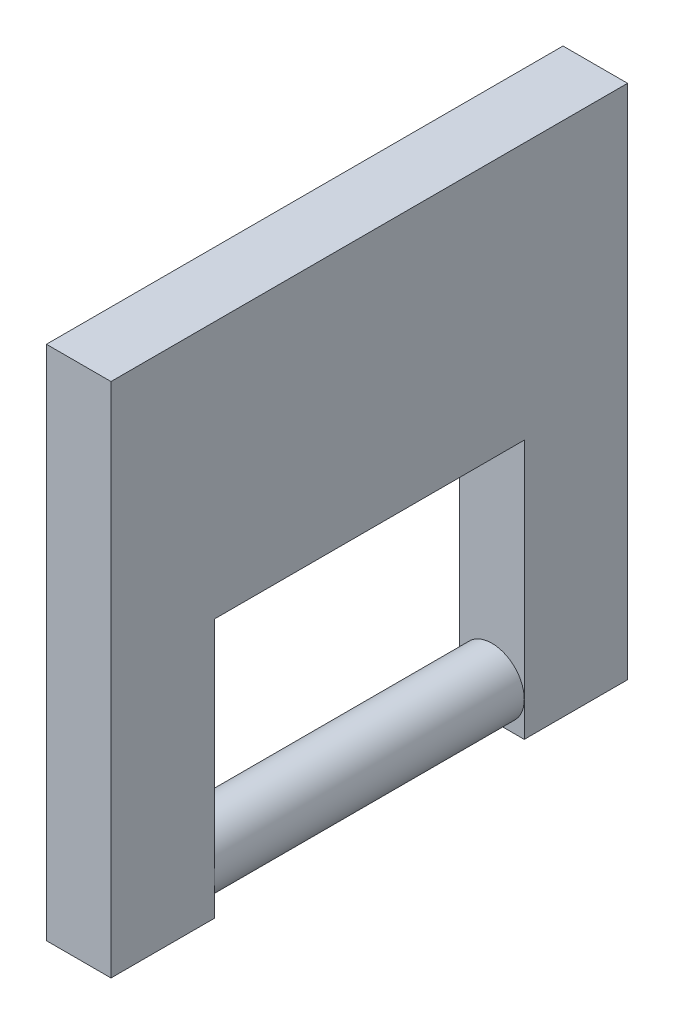
ISO-10303-21;
HEADER;
FILE_DESCRIPTION(('STEP AP214'),'2;1');
FILE_NAME('part.step','',(''),(''),'','','');
FILE_SCHEMA(('AUTOMOTIVE_DESIGN { 1 0 10303 214 1 1 1 1 }'));
ENDSEC;
DATA;
#1=APPLICATION_CONTEXT('core data for automotive mechanical design processes');
#2=APPLICATION_PROTOCOL_DEFINITION('international standard','automotive_design',2000,#1);
#3=PRODUCT_CONTEXT('',#1,'mechanical');
#4=PRODUCT('Part','Part','',(#3));
#5=PRODUCT_RELATED_PRODUCT_CATEGORY('part','',(#4));
#6=PRODUCT_DEFINITION_FORMATION('','',#4);
#7=PRODUCT_DEFINITION_CONTEXT('part definition',#1,'design');
#8=PRODUCT_DEFINITION('design','',#6,#7);
#9=PRODUCT_DEFINITION_SHAPE('','',#8);
#10=(LENGTH_UNIT() NAMED_UNIT(*) SI_UNIT(.MILLI.,.METRE.));
#11=(NAMED_UNIT(*) PLANE_ANGLE_UNIT() SI_UNIT($,.RADIAN.));
#12=(NAMED_UNIT(*) SI_UNIT($,.STERADIAN.) SOLID_ANGLE_UNIT());
#13=UNCERTAINTY_MEASURE_WITH_UNIT(LENGTH_MEASURE(1.E-05),#10,'distance_accuracy_value','');
#14=(GEOMETRIC_REPRESENTATION_CONTEXT(3) GLOBAL_UNCERTAINTY_ASSIGNED_CONTEXT((#13)) GLOBAL_UNIT_ASSIGNED_CONTEXT((#10,
#11,#12)) REPRESENTATION_CONTEXT('',''));
#15=CARTESIAN_POINT('',(0.,0.,0.));
#16=DIRECTION('',(0.,0.,1.));
#17=DIRECTION('',(1.,0.,0.));
#18=AXIS2_PLACEMENT_3D('',#15,#16,#17);
#19=CARTESIAN_POINT('',(0.,-31.7574793875147,45.827703180212));
#20=DIRECTION('',(0.,0.,-1.));
#21=DIRECTION('',(-1.,0.,0.));
#22=AXIS2_PLACEMENT_3D('',#19,#20,#21);
#23=PLANE('',#22);
#24=CARTESIAN_POINT('',(1.5875,-30.0448686602337,45.827703180212));
#25=DIRECTION('',(0.,0.,1.));
#26=DIRECTION('',(1.,0.,0.));
#27=AXIS2_PLACEMENT_3D('',#24,#25,#26);
#28=CIRCLE('',#27,1.5875);
#29=CARTESIAN_POINT('',(0.,-30.0448686602337,45.827703180212));
#30=VERTEX_POINT('',#29);
#31=CARTESIAN_POINT('',(3.175,-30.0448686602337,45.827703180212));
#32=VERTEX_POINT('',#31);
#33=EDGE_CURVE('E140',#30,#32,#28,.T.);
#34=ORIENTED_EDGE('',*,*,#33,.F.);
#35=DIRECTION('',(0.,1.,0.));
#36=VECTOR('',#35,1.);
#37=CARTESIAN_POINT('',(0.,-31.7574793875147,45.827703180212));
#38=LINE('',#37,#36);
#39=CARTESIAN_POINT('',(0.,-31.7574793875147,45.827703180212));
#40=VERTEX_POINT('',#39);
#41=EDGE_CURVE('E143',#40,#30,#38,.T.);
#42=ORIENTED_EDGE('',*,*,#41,.F.);
#43=DIRECTION('',(1.,0.,0.));
#44=VECTOR('',#43,1.);
#45=CARTESIAN_POINT('',(0.,-31.7574793875147,45.827703180212));
#46=LINE('',#45,#44);
#47=CARTESIAN_POINT('',(3.175,-31.7574793875147,45.827703180212));
#48=VERTEX_POINT('',#47);
#49=EDGE_CURVE('E153',#40,#48,#46,.T.);
#50=ORIENTED_EDGE('',*,*,#49,.T.);
#51=DIRECTION('',(0.,1.,0.));
#52=VECTOR('',#51,1.);
#53=CARTESIAN_POINT('',(3.175,-31.7574793875147,45.827703180212));
#54=LINE('',#53,#52);
#55=EDGE_CURVE('E138',#48,#32,#54,.T.);
#56=ORIENTED_EDGE('',*,*,#55,.T.);
#57=EDGE_LOOP('',(#34,#42,#50,#56));
#58=FACE_BOUND('',#57,.T.);
#59=ADVANCED_FACE('F33',(#58),#23,.F.);
#60=EDGE_CURVE('E48',#32,#30,#28,.T.);
#61=ORIENTED_EDGE('',*,*,#60,.F.);
#62=CARTESIAN_POINT('',(3.175,-19.0128997924515,45.827703180212));
#63=VERTEX_POINT('',#62);
#64=EDGE_CURVE('E136',#32,#63,#54,.T.);
#65=ORIENTED_EDGE('',*,*,#64,.T.);
#66=DIRECTION('',(1.,0.,0.));
#67=VECTOR('',#66,1.);
#68=CARTESIAN_POINT('',(0.,-19.0128997924515,45.827703180212));
#69=LINE('',#68,#67);
#70=CARTESIAN_POINT('',(0.,-19.0128997924515,45.827703180212));
#71=VERTEX_POINT('',#70);
#72=EDGE_CURVE('E149',#71,#63,#69,.T.);
#73=ORIENTED_EDGE('',*,*,#72,.F.);
#74=EDGE_CURVE('E117',#30,#71,#38,.T.);
#75=ORIENTED_EDGE('',*,*,#74,.F.);
#76=EDGE_LOOP('',(#61,#65,#73,#75));
#77=FACE_BOUND('',#76,.T.);
#78=ADVANCED_FACE('F217',(#77),#23,.F.);
#79=CARTESIAN_POINT('',(0.,-31.7574793875147,61.067703180212));
#80=DIRECTION('',(0.,0.,1.));
#81=DIRECTION('',(1.,0.,0.));
#82=AXIS2_PLACEMENT_3D('',#79,#80,#81);
#83=PLANE('',#82);
#84=CARTESIAN_POINT('',(1.5875,-30.0448686602337,61.067703180212));
#85=DIRECTION('',(0.,0.,1.));
#86=DIRECTION('',(1.,0.,0.));
#87=AXIS2_PLACEMENT_3D('',#84,#85,#86);
#88=CIRCLE('',#87,1.5875);
#89=CARTESIAN_POINT('',(3.175,-30.0448686602337,61.067703180212));
#90=VERTEX_POINT('',#89);
#91=CARTESIAN_POINT('',(0.,-30.0448686602337,61.067703180212));
#92=VERTEX_POINT('',#91);
#93=EDGE_CURVE('E11',#90,#92,#88,.F.);
#94=ORIENTED_EDGE('',*,*,#93,.F.);
#95=DIRECTION('',(0.,-1.,0.));
#96=VECTOR('',#95,1.);
#97=CARTESIAN_POINT('',(3.175,-31.7574793875147,61.067703180212));
#98=LINE('',#97,#96);
#99=CARTESIAN_POINT('',(3.175,-31.7574793875147,61.067703180212));
#100=VERTEX_POINT('',#99);
#101=EDGE_CURVE('E118',#90,#100,#98,.T.);
#102=ORIENTED_EDGE('',*,*,#101,.T.);
#103=DIRECTION('',(1.,0.,0.));
#104=VECTOR('',#103,1.);
#105=CARTESIAN_POINT('',(0.,-31.7574793875147,61.067703180212));
#106=LINE('',#105,#104);
#107=CARTESIAN_POINT('',(0.,-31.7574793875147,61.067703180212));
#108=VERTEX_POINT('',#107);
#109=EDGE_CURVE('E156',#108,#100,#106,.T.);
#110=ORIENTED_EDGE('',*,*,#109,.F.);
#111=DIRECTION('',(0.,-1.,0.));
#112=VECTOR('',#111,1.);
#113=CARTESIAN_POINT('',(0.,-31.7574793875147,61.067703180212));
#114=LINE('',#113,#112);
#115=EDGE_CURVE('E131',#92,#108,#114,.T.);
#116=ORIENTED_EDGE('',*,*,#115,.F.);
#117=EDGE_LOOP('',(#94,#102,#110,#116));
#118=FACE_BOUND('',#117,.T.);
#119=ADVANCED_FACE('F130',(#118),#83,.F.);
#120=CARTESIAN_POINT('',(1.5875,-30.0448686602337,61.067703180212));
#121=DIRECTION('',(0.,0.,1.));
#122=DIRECTION('',(1.,0.,0.));
#123=AXIS2_PLACEMENT_3D('',#120,#121,#122);
#124=CIRCLE('',#123,1.5875);
#125=EDGE_CURVE('E56',#90,#92,#124,.T.);
#126=ORIENTED_EDGE('',*,*,#125,.T.);
#127=CARTESIAN_POINT('',(0.,-19.0128997924515,61.067703180212));
#128=VERTEX_POINT('',#127);
#129=EDGE_CURVE('E148',#128,#92,#114,.T.);
#130=ORIENTED_EDGE('',*,*,#129,.F.);
#131=DIRECTION('',(1.,0.,0.));
#132=VECTOR('',#131,1.);
#133=CARTESIAN_POINT('',(0.,-19.0128997924515,61.067703180212));
#134=LINE('',#133,#132);
#135=CARTESIAN_POINT('',(3.175,-19.0128997924515,61.067703180212));
#136=VERTEX_POINT('',#135);
#137=EDGE_CURVE('E113',#128,#136,#134,.T.);
#138=ORIENTED_EDGE('',*,*,#137,.T.);
#139=EDGE_CURVE('E109',#136,#90,#98,.T.);
#140=ORIENTED_EDGE('',*,*,#139,.T.);
#141=EDGE_LOOP('',(#126,#130,#138,#140));
#142=FACE_BOUND('',#141,.T.);
#143=ADVANCED_FACE('F111',(#142),#83,.F.);
#144=CARTESIAN_POINT('',(3.175,-31.7574793875147,66.147703180212));
#145=DIRECTION('',(0.,1.,0.));
#146=DIRECTION('',(0.,0.,1.));
#147=AXIS2_PLACEMENT_3D('',#144,#145,#146);
#148=PLANE('',#147);
#149=DIRECTION('',(0.,0.,-1.));
#150=VECTOR('',#149,1.);
#151=CARTESIAN_POINT('',(3.175,-31.7574793875147,66.147703180212));
#152=LINE('',#151,#150);
#153=CARTESIAN_POINT('',(3.175,-31.7574793875147,40.747703180212));
#154=VERTEX_POINT('',#153);
#155=EDGE_CURVE('E163',#48,#154,#152,.T.);
#156=ORIENTED_EDGE('',*,*,#155,.F.);
#157=ORIENTED_EDGE('',*,*,#49,.F.);
#158=DIRECTION('',(0.,0.,-1.));
#159=VECTOR('',#158,1.);
#160=CARTESIAN_POINT('',(0.,-31.7574793875147,66.147703180212));
#161=LINE('',#160,#159);
#162=CARTESIAN_POINT('',(0.,-31.7574793875147,40.747703180212));
#163=VERTEX_POINT('',#162);
#164=EDGE_CURVE('E173',#40,#163,#161,.T.);
#165=ORIENTED_EDGE('',*,*,#164,.T.);
#166=DIRECTION('',(-1.,0.,0.));
#167=VECTOR('',#166,1.);
#168=CARTESIAN_POINT('',(3.175,-31.7574793875147,40.747703180212));
#169=LINE('',#168,#167);
#170=EDGE_CURVE('E185',#154,#163,#169,.T.);
#171=ORIENTED_EDGE('',*,*,#170,.F.);
#172=EDGE_LOOP('',(#156,#157,#165,#171));
#173=FACE_BOUND('',#172,.T.);
#174=ADVANCED_FACE('F235',(#173),#148,.F.);
#175=CARTESIAN_POINT('',(3.175,-6.35747938751472,66.147703180212));
#176=DIRECTION('',(0.,0.,-1.));
#177=DIRECTION('',(-1.,0.,0.));
#178=AXIS2_PLACEMENT_3D('',#175,#176,#177);
#179=PLANE('',#178);
#180=DIRECTION('',(0.,-1.,0.));
#181=VECTOR('',#180,1.);
#182=CARTESIAN_POINT('',(0.,-6.35747938751472,66.147703180212));
#183=LINE('',#182,#181);
#184=CARTESIAN_POINT('',(0.,-6.35747938751472,66.147703180212));
#185=VERTEX_POINT('',#184);
#186=CARTESIAN_POINT('',(0.,-31.7574793875147,66.147703180212));
#187=VERTEX_POINT('',#186);
#188=EDGE_CURVE('E155',#185,#187,#183,.T.);
#189=ORIENTED_EDGE('',*,*,#188,.T.);
#190=DIRECTION('',(-1.,0.,0.));
#191=VECTOR('',#190,1.);
#192=CARTESIAN_POINT('',(3.175,-31.7574793875147,66.147703180212));
#193=LINE('',#192,#191);
#194=CARTESIAN_POINT('',(3.175,-31.7574793875147,66.147703180212));
#195=VERTEX_POINT('',#194);
#196=EDGE_CURVE('E41',#195,#187,#193,.T.);
#197=ORIENTED_EDGE('',*,*,#196,.F.);
#198=DIRECTION('',(0.,-1.,0.));
#199=VECTOR('',#198,1.);
#200=CARTESIAN_POINT('',(3.175,-6.35747938751472,66.147703180212));
#201=LINE('',#200,#199);
#202=CARTESIAN_POINT('',(3.175,-6.35747938751472,66.147703180212));
#203=VERTEX_POINT('',#202);
#204=EDGE_CURVE('E161',#203,#195,#201,.T.);
#205=ORIENTED_EDGE('',*,*,#204,.F.);
#206=DIRECTION('',(-1.,0.,0.));
#207=VECTOR('',#206,1.);
#208=CARTESIAN_POINT('',(3.175,-6.35747938751472,66.147703180212));
#209=LINE('',#208,#207);
#210=EDGE_CURVE('E170',#203,#185,#209,.T.);
#211=ORIENTED_EDGE('',*,*,#210,.T.);
#212=EDGE_LOOP('',(#189,#197,#205,#211));
#213=FACE_BOUND('',#212,.T.);
#214=ADVANCED_FACE('F35',(#213),#179,.F.);
#215=EDGE_CURVE('E174',#187,#108,#161,.T.);
#216=ORIENTED_EDGE('',*,*,#215,.T.);
#217=ORIENTED_EDGE('',*,*,#109,.T.);
#218=EDGE_CURVE('E125',#195,#100,#152,.T.);
#219=ORIENTED_EDGE('',*,*,#218,.F.);
#220=ORIENTED_EDGE('',*,*,#196,.T.);
#221=EDGE_LOOP('',(#216,#217,#219,#220));
#222=FACE_BOUND('',#221,.T.);
#223=ADVANCED_FACE('F190',(#222),#148,.F.);
#224=CARTESIAN_POINT('',(3.175,-6.35747938751472,40.747703180212));
#225=DIRECTION('',(0.,0.,1.));
#226=DIRECTION('',(0.,-1.,0.));
#227=AXIS2_PLACEMENT_3D('',#224,#225,#226);
#228=PLANE('',#227);
#229=DIRECTION('',(0.,1.,0.));
#230=VECTOR('',#229,1.);
#231=CARTESIAN_POINT('',(0.,-6.35747938751472,40.747703180212));
#232=LINE('',#231,#230);
#233=CARTESIAN_POINT('',(0.,-6.35747938751472,40.747703180212));
#234=VERTEX_POINT('',#233);
#235=EDGE_CURVE('E177',#163,#234,#232,.T.);
#236=ORIENTED_EDGE('',*,*,#235,.T.);
#237=DIRECTION('',(-1.,0.,0.));
#238=VECTOR('',#237,1.);
#239=CARTESIAN_POINT('',(3.175,-6.35747938751472,40.747703180212));
#240=LINE('',#239,#238);
#241=CARTESIAN_POINT('',(3.175,-6.35747938751472,40.747703180212));
#242=VERTEX_POINT('',#241);
#243=EDGE_CURVE('E182',#242,#234,#240,.T.);
#244=ORIENTED_EDGE('',*,*,#243,.F.);
#245=DIRECTION('',(0.,1.,0.));
#246=VECTOR('',#245,1.);
#247=CARTESIAN_POINT('',(3.175,-6.35747938751472,40.747703180212));
#248=LINE('',#247,#246);
#249=EDGE_CURVE('E166',#154,#242,#248,.T.);
#250=ORIENTED_EDGE('',*,*,#249,.F.);
#251=ORIENTED_EDGE('',*,*,#170,.T.);
#252=EDGE_LOOP('',(#236,#244,#250,#251));
#253=FACE_BOUND('',#252,.T.);
#254=ADVANCED_FACE('F230',(#253),#228,.F.);
#255=CARTESIAN_POINT('',(3.175,-6.35747938751472,66.147703180212));
#256=DIRECTION('',(0.,-1.,0.));
#257=DIRECTION('',(0.,0.,-1.));
#258=AXIS2_PLACEMENT_3D('',#255,#256,#257);
#259=PLANE('',#258);
#260=DIRECTION('',(0.,0.,1.));
#261=VECTOR('',#260,1.);
#262=CARTESIAN_POINT('',(0.,-6.35747938751472,66.147703180212));
#263=LINE('',#262,#261);
#264=EDGE_CURVE('E164',#234,#185,#263,.T.);
#265=ORIENTED_EDGE('',*,*,#264,.T.);
#266=ORIENTED_EDGE('',*,*,#210,.F.);
#267=DIRECTION('',(0.,0.,1.));
#268=VECTOR('',#267,1.);
#269=CARTESIAN_POINT('',(3.175,-6.35747938751472,66.147703180212));
#270=LINE('',#269,#268);
#271=EDGE_CURVE('E168',#242,#203,#270,.T.);
#272=ORIENTED_EDGE('',*,*,#271,.F.);
#273=ORIENTED_EDGE('',*,*,#243,.T.);
#274=EDGE_LOOP('',(#265,#266,#272,#273));
#275=FACE_BOUND('',#274,.T.);
#276=ADVANCED_FACE('F225',(#275),#259,.F.);
#277=CARTESIAN_POINT('',(3.175,-31.7574793875147,66.147703180212));
#278=DIRECTION('',(1.,0.,0.));
#279=DIRECTION('',(0.,0.,-1.));
#280=AXIS2_PLACEMENT_3D('',#277,#278,#279);
#281=PLANE('',#280);
#282=ORIENTED_EDGE('',*,*,#55,.F.);
#283=ORIENTED_EDGE('',*,*,#155,.T.);
#284=ORIENTED_EDGE('',*,*,#249,.T.);
#285=ORIENTED_EDGE('',*,*,#271,.T.);
#286=ORIENTED_EDGE('',*,*,#204,.T.);
#287=ORIENTED_EDGE('',*,*,#218,.T.);
#288=ORIENTED_EDGE('',*,*,#101,.F.);
#289=ORIENTED_EDGE('',*,*,#139,.F.);
#290=DIRECTION('',(0.,0.,1.));
#291=VECTOR('',#290,1.);
#292=CARTESIAN_POINT('',(3.175,-19.0128997924515,45.827703180212));
#293=LINE('',#292,#291);
#294=EDGE_CURVE('E129',#63,#136,#293,.T.);
#295=ORIENTED_EDGE('',*,*,#294,.F.);
#296=ORIENTED_EDGE('',*,*,#64,.F.);
#297=EDGE_LOOP('',(#282,#283,#284,#285,#286,#287,#288,#289,#295,#296));
#298=FACE_BOUND('',#297,.T.);
#299=ADVANCED_FACE('F123',(#298),#281,.T.);
#300=CARTESIAN_POINT('',(0.,-31.7574793875147,66.147703180212));
#301=DIRECTION('',(1.,0.,0.));
#302=DIRECTION('',(0.,0.,-1.));
#303=AXIS2_PLACEMENT_3D('',#300,#301,#302);
#304=PLANE('',#303);
#305=ORIENTED_EDGE('',*,*,#164,.F.);
#306=ORIENTED_EDGE('',*,*,#41,.T.);
#307=ORIENTED_EDGE('',*,*,#74,.T.);
#308=DIRECTION('',(0.,0.,1.));
#309=VECTOR('',#308,1.);
#310=CARTESIAN_POINT('',(0.,-19.0128997924515,45.827703180212));
#311=LINE('',#310,#309);
#312=EDGE_CURVE('E145',#71,#128,#311,.T.);
#313=ORIENTED_EDGE('',*,*,#312,.T.);
#314=ORIENTED_EDGE('',*,*,#129,.T.);
#315=ORIENTED_EDGE('',*,*,#115,.T.);
#316=ORIENTED_EDGE('',*,*,#215,.F.);
#317=ORIENTED_EDGE('',*,*,#188,.F.);
#318=ORIENTED_EDGE('',*,*,#264,.F.);
#319=ORIENTED_EDGE('',*,*,#235,.F.);
#320=EDGE_LOOP('',(#305,#306,#307,#313,#314,#315,#316,#317,#318,#319));
#321=FACE_BOUND('',#320,.T.);
#322=ADVANCED_FACE('F198',(#321),#304,.F.);
#323=CARTESIAN_POINT('',(0.,-19.0128997924515,45.827703180212));
#324=DIRECTION('',(0.,1.,0.));
#325=DIRECTION('',(0.,0.,1.));
#326=AXIS2_PLACEMENT_3D('',#323,#324,#325);
#327=PLANE('',#326);
#328=ORIENTED_EDGE('',*,*,#294,.T.);
#329=ORIENTED_EDGE('',*,*,#137,.F.);
#330=ORIENTED_EDGE('',*,*,#312,.F.);
#331=ORIENTED_EDGE('',*,*,#72,.T.);
#332=EDGE_LOOP('',(#328,#329,#330,#331));
#333=FACE_BOUND('',#332,.T.);
#334=ADVANCED_FACE('F202',(#333),#327,.F.);
#335=CARTESIAN_POINT('',(1.5875,-30.0448686602337,61.067703180212));
#336=DIRECTION('',(0.,0.,-1.));
#337=DIRECTION('',(-1.,0.,0.));
#338=AXIS2_PLACEMENT_3D('',#335,#336,#337);
#339=CYLINDRICAL_SURFACE('',#338,1.5875);
#340=ORIENTED_EDGE('',*,*,#125,.F.);
#341=ORIENTED_EDGE('',*,*,#93,.T.);
#342=EDGE_LOOP('',(#340,#341));
#343=FACE_BOUND('',#342,.T.);
#344=ORIENTED_EDGE('',*,*,#60,.T.);
#345=ORIENTED_EDGE('',*,*,#33,.T.);
#346=EDGE_LOOP('',(#344,#345));
#347=FACE_BOUND('',#346,.T.);
#348=ADVANCED_FACE('F134',(#343,#347),#339,.T.);
#349=CLOSED_SHELL('',(#59,#78,#119,#143,#174,#214,#223,#254,#276,#299,#322,#334,#348));
#350=MANIFOLD_SOLID_BREP('B2',#349);
#351=ADVANCED_BREP_SHAPE_REPRESENTATION('',(#18,#350),#14);
#352=SHAPE_DEFINITION_REPRESENTATION(#9,#351);
ENDSEC;
END-ISO-10303-21;
